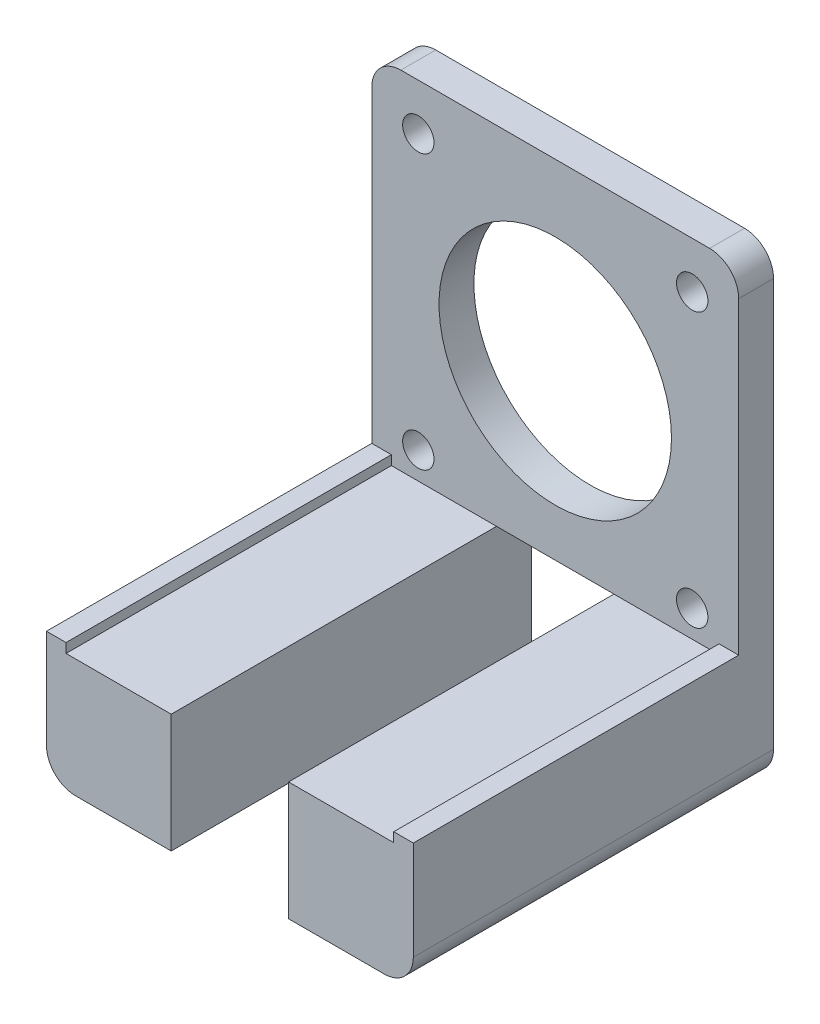
ISO-10303-21;
HEADER;
FILE_DESCRIPTION(('STEP AP214'),'2;1');
FILE_NAME('part.step','',(''),(''),'','','');
FILE_SCHEMA(('AUTOMOTIVE_DESIGN { 1 0 10303 214 1 1 1 1 }'));
ENDSEC;
DATA;
#1=APPLICATION_CONTEXT('core data for automotive mechanical design processes');
#2=APPLICATION_PROTOCOL_DEFINITION('international standard','automotive_design',2000,#1);
#3=PRODUCT_CONTEXT('',#1,'mechanical');
#4=PRODUCT('Part','Part','',(#3));
#5=PRODUCT_RELATED_PRODUCT_CATEGORY('part','',(#4));
#6=PRODUCT_DEFINITION_FORMATION('','',#4);
#7=PRODUCT_DEFINITION_CONTEXT('part definition',#1,'design');
#8=PRODUCT_DEFINITION('design','',#6,#7);
#9=PRODUCT_DEFINITION_SHAPE('','',#8);
#10=(LENGTH_UNIT() NAMED_UNIT(*) SI_UNIT(.MILLI.,.METRE.));
#11=(NAMED_UNIT(*) PLANE_ANGLE_UNIT() SI_UNIT($,.RADIAN.));
#12=(NAMED_UNIT(*) SI_UNIT($,.STERADIAN.) SOLID_ANGLE_UNIT());
#13=UNCERTAINTY_MEASURE_WITH_UNIT(LENGTH_MEASURE(1.E-05),#10,'distance_accuracy_value','');
#14=(GEOMETRIC_REPRESENTATION_CONTEXT(3) GLOBAL_UNCERTAINTY_ASSIGNED_CONTEXT((#13)) GLOBAL_UNIT_ASSIGNED_CONTEXT((#10,
#11,#12)) REPRESENTATION_CONTEXT('',''));
#15=CARTESIAN_POINT('',(0.,0.,0.));
#16=DIRECTION('',(0.,0.,1.));
#17=DIRECTION('',(1.,0.,0.));
#18=AXIS2_PLACEMENT_3D('',#15,#16,#17);
#19=CARTESIAN_POINT('',(0.,8.,6.));
#20=DIRECTION('',(0.,1.,0.));
#21=DIRECTION('',(0.,0.,1.));
#22=AXIS2_PLACEMENT_3D('',#19,#20,#21);
#23=PLANE('',#22);
#24=DIRECTION('',(1.,0.,0.));
#25=VECTOR('',#24,1.);
#26=CARTESIAN_POINT('',(0.,8.,0.));
#27=LINE('',#26,#25);
#28=CARTESIAN_POINT('',(-2.99999999999947,8.,0.));
#29=VERTEX_POINT('',#28);
#30=CARTESIAN_POINT('',(50.1400000000005,8.,0.));
#31=VERTEX_POINT('',#30);
#32=EDGE_CURVE('E395',#29,#31,#27,.T.);
#33=ORIENTED_EDGE('',*,*,#32,.F.);
#34=DIRECTION('',(0.,0.,-1.));
#35=VECTOR('',#34,1.);
#36=CARTESIAN_POINT('',(-2.99999999999947,8.,6.));
#37=LINE('',#36,#35);
#38=CARTESIAN_POINT('',(-2.99999999999947,8.,6.));
#39=VERTEX_POINT('',#38);
#40=EDGE_CURVE('E11',#39,#29,#37,.T.);
#41=ORIENTED_EDGE('',*,*,#40,.F.);
#42=DIRECTION('',(1.,0.,0.));
#43=VECTOR('',#42,1.);
#44=CARTESIAN_POINT('',(0.,8.,6.));
#45=LINE('',#44,#43);
#46=CARTESIAN_POINT('',(50.1400000000005,8.,6.));
#47=VERTEX_POINT('',#46);
#48=EDGE_CURVE('E357',#39,#47,#45,.T.);
#49=ORIENTED_EDGE('',*,*,#48,.T.);
#50=DIRECTION('',(0.,0.,-1.));
#51=VECTOR('',#50,1.);
#52=CARTESIAN_POINT('',(50.1400000000005,8.,6.));
#53=LINE('',#52,#51);
#54=EDGE_CURVE('E379',#47,#31,#53,.T.);
#55=ORIENTED_EDGE('',*,*,#54,.T.);
#56=EDGE_LOOP('',(#33,#41,#49,#55));
#57=FACE_BOUND('',#56,.T.);
#58=ADVANCED_FACE('F40',(#57),#23,.T.);
#59=CARTESIAN_POINT('',(-2.99999999999951,3.,6.));
#60=DIRECTION('',(0.,0.,-1.));
#61=DIRECTION('',(-1.,0.,0.));
#62=AXIS2_PLACEMENT_3D('',#59,#60,#61);
#63=CYLINDRICAL_SURFACE('',#62,5.);
#64=CARTESIAN_POINT('',(-2.99999999999951,3.,0.));
#65=DIRECTION('',(0.,0.,1.));
#66=DIRECTION('',(1.,0.,0.));
#67=AXIS2_PLACEMENT_3D('',#64,#65,#66);
#68=CIRCLE('',#67,5.);
#69=CARTESIAN_POINT('',(-7.99999999999951,2.99999999999996,0.));
#70=VERTEX_POINT('',#69);
#71=EDGE_CURVE('E399',#29,#70,#68,.T.);
#72=ORIENTED_EDGE('',*,*,#71,.T.);
#73=DIRECTION('',(0.,0.,-1.));
#74=VECTOR('',#73,1.);
#75=CARTESIAN_POINT('',(-7.99999999999951,2.99999999999996,6.));
#76=LINE('',#75,#74);
#77=CARTESIAN_POINT('',(-7.99999999999951,2.99999999999996,6.));
#78=VERTEX_POINT('',#77);
#79=EDGE_CURVE('E49',#78,#70,#76,.T.);
#80=ORIENTED_EDGE('',*,*,#79,.F.);
#81=CARTESIAN_POINT('',(-2.99999999999951,3.,6.));
#82=DIRECTION('',(0.,0.,1.));
#83=DIRECTION('',(1.,0.,0.));
#84=AXIS2_PLACEMENT_3D('',#81,#82,#83);
#85=CIRCLE('',#84,5.);
#86=EDGE_CURVE('E361',#39,#78,#85,.T.);
#87=ORIENTED_EDGE('',*,*,#86,.F.);
#88=ORIENTED_EDGE('',*,*,#40,.T.);
#89=EDGE_LOOP('',(#72,#80,#87,#88));
#90=FACE_BOUND('',#89,.T.);
#91=ADVANCED_FACE('F432',(#90),#63,.T.);
#92=CARTESIAN_POINT('',(-7.99999999999951,0.,6.));
#93=DIRECTION('',(-1.,0.,0.));
#94=DIRECTION('',(0.,0.,1.));
#95=AXIS2_PLACEMENT_3D('',#92,#93,#94);
#96=PLANE('',#95);
#97=DIRECTION('',(0.,1.,0.));
#98=VECTOR('',#97,1.);
#99=CARTESIAN_POINT('',(-7.99999999999951,0.,0.));
#100=LINE('',#99,#98);
#101=CARTESIAN_POINT('',(-7.99999999999951,-67.17,0.));
#102=VERTEX_POINT('',#101);
#103=EDGE_CURVE('E403',#102,#70,#100,.T.);
#104=ORIENTED_EDGE('',*,*,#103,.F.);
#105=DIRECTION('',(0.,0.,1.));
#106=VECTOR('',#105,1.);
#107=CARTESIAN_POINT('',(-7.99999999999951,-67.17,0.));
#108=LINE('',#107,#106);
#109=CARTESIAN_POINT('',(-7.99999999999951,-67.17,62.));
#110=VERTEX_POINT('',#109);
#111=EDGE_CURVE('E315',#102,#110,#108,.T.);
#112=ORIENTED_EDGE('',*,*,#111,.T.);
#113=DIRECTION('',(0.,-1.,0.));
#114=VECTOR('',#113,1.);
#115=CARTESIAN_POINT('',(-7.99999999999951,0.,62.));
#116=LINE('',#115,#114);
#117=CARTESIAN_POINT('',(-7.99999999999951,-50.14,62.));
#118=VERTEX_POINT('',#117);
#119=EDGE_CURVE('E291',#118,#110,#116,.T.);
#120=ORIENTED_EDGE('',*,*,#119,.F.);
#121=DIRECTION('',(0.,0.,1.));
#122=VECTOR('',#121,1.);
#123=CARTESIAN_POINT('',(-7.99999999999951,-50.14,0.));
#124=LINE('',#123,#122);
#125=CARTESIAN_POINT('',(-7.99999999999951,-50.14,6.));
#126=VERTEX_POINT('',#125);
#127=EDGE_CURVE('E318',#126,#118,#124,.T.);
#128=ORIENTED_EDGE('',*,*,#127,.F.);
#129=DIRECTION('',(0.,1.,0.));
#130=VECTOR('',#129,1.);
#131=CARTESIAN_POINT('',(-7.99999999999951,0.,6.));
#132=LINE('',#131,#130);
#133=EDGE_CURVE('E364',#126,#78,#132,.T.);
#134=ORIENTED_EDGE('',*,*,#133,.T.);
#135=ORIENTED_EDGE('',*,*,#79,.T.);
#136=EDGE_LOOP('',(#104,#112,#120,#128,#134,#135));
#137=FACE_BOUND('',#136,.T.);
#138=ADVANCED_FACE('F425',(#137),#96,.T.);
#139=CARTESIAN_POINT('',(55.1400000000005,0.,6.));
#140=DIRECTION('',(-1.,0.,0.));
#141=DIRECTION('',(0.,0.,1.));
#142=AXIS2_PLACEMENT_3D('',#139,#140,#141);
#143=PLANE('',#142);
#144=DIRECTION('',(0.,1.,0.));
#145=VECTOR('',#144,1.);
#146=CARTESIAN_POINT('',(55.1400000000005,0.,0.));
#147=LINE('',#146,#145);
#148=CARTESIAN_POINT('',(55.1400000000005,-67.17,0.));
#149=VERTEX_POINT('',#148);
#150=CARTESIAN_POINT('',(55.1400000000005,2.99999999999996,0.));
#151=VERTEX_POINT('',#150);
#152=EDGE_CURVE('E407',#149,#151,#147,.T.);
#153=ORIENTED_EDGE('',*,*,#152,.T.);
#154=DIRECTION('',(0.,0.,-1.));
#155=VECTOR('',#154,1.);
#156=CARTESIAN_POINT('',(55.1400000000005,2.99999999999996,6.));
#157=LINE('',#156,#155);
#158=CARTESIAN_POINT('',(55.1400000000005,2.99999999999996,6.));
#159=VERTEX_POINT('',#158);
#160=EDGE_CURVE('E420',#159,#151,#157,.T.);
#161=ORIENTED_EDGE('',*,*,#160,.F.);
#162=DIRECTION('',(0.,1.,0.));
#163=VECTOR('',#162,1.);
#164=CARTESIAN_POINT('',(55.1400000000005,0.,6.));
#165=LINE('',#164,#163);
#166=CARTESIAN_POINT('',(55.1400000000005,-50.14,6.));
#167=VERTEX_POINT('',#166);
#168=EDGE_CURVE('E368',#167,#159,#165,.T.);
#169=ORIENTED_EDGE('',*,*,#168,.F.);
#170=DIRECTION('',(0.,0.,-1.));
#171=VECTOR('',#170,1.);
#172=CARTESIAN_POINT('',(55.1400000000005,-50.14,62.));
#173=LINE('',#172,#171);
#174=CARTESIAN_POINT('',(55.1400000000005,-50.14,62.));
#175=VERTEX_POINT('',#174);
#176=EDGE_CURVE('E262',#175,#167,#173,.T.);
#177=ORIENTED_EDGE('',*,*,#176,.F.);
#178=DIRECTION('',(0.,-1.,0.));
#179=VECTOR('',#178,1.);
#180=CARTESIAN_POINT('',(55.1400000000005,0.,62.));
#181=LINE('',#180,#179);
#182=CARTESIAN_POINT('',(55.1400000000005,-67.17,62.));
#183=VERTEX_POINT('',#182);
#184=EDGE_CURVE('E214',#175,#183,#181,.T.);
#185=ORIENTED_EDGE('',*,*,#184,.T.);
#186=DIRECTION('',(0.,0.,-1.));
#187=VECTOR('',#186,1.);
#188=CARTESIAN_POINT('',(55.1400000000005,-67.17,62.));
#189=LINE('',#188,#187);
#190=EDGE_CURVE('E240',#183,#149,#189,.T.);
#191=ORIENTED_EDGE('',*,*,#190,.T.);
#192=EDGE_LOOP('',(#153,#161,#169,#177,#185,#191));
#193=FACE_BOUND('',#192,.T.);
#194=ADVANCED_FACE('F460',(#193),#143,.F.);
#195=CARTESIAN_POINT('',(50.1400000000005,3.,6.));
#196=DIRECTION('',(0.,0.,-1.));
#197=DIRECTION('',(-1.,0.,0.));
#198=AXIS2_PLACEMENT_3D('',#195,#196,#197);
#199=CYLINDRICAL_SURFACE('',#198,5.);
#200=CARTESIAN_POINT('',(50.1400000000005,3.,0.));
#201=DIRECTION('',(0.,0.,1.));
#202=DIRECTION('',(1.,0.,0.));
#203=AXIS2_PLACEMENT_3D('',#200,#201,#202);
#204=CIRCLE('',#203,5.);
#205=EDGE_CURVE('E411',#31,#151,#204,.F.);
#206=ORIENTED_EDGE('',*,*,#205,.F.);
#207=ORIENTED_EDGE('',*,*,#54,.F.);
#208=CARTESIAN_POINT('',(50.1400000000005,3.,6.));
#209=DIRECTION('',(0.,0.,1.));
#210=DIRECTION('',(1.,0.,0.));
#211=AXIS2_PLACEMENT_3D('',#208,#209,#210);
#212=CIRCLE('',#211,5.);
#213=EDGE_CURVE('E371',#47,#159,#212,.F.);
#214=ORIENTED_EDGE('',*,*,#213,.T.);
#215=ORIENTED_EDGE('',*,*,#160,.T.);
#216=EDGE_LOOP('',(#206,#207,#214,#215));
#217=FACE_BOUND('',#216,.T.);
#218=ADVANCED_FACE('F456',(#217),#199,.T.);
#219=CARTESIAN_POINT('',(47.1400000000005,-47.14,6.));
#220=DIRECTION('',(0.,0.,-1.));
#221=DIRECTION('',(-1.,0.,0.));
#222=AXIS2_PLACEMENT_3D('',#219,#220,#221);
#223=CYLINDRICAL_SURFACE('',#222,2.7);
#224=CARTESIAN_POINT('',(47.1400000000005,-47.14,6.));
#225=DIRECTION('',(0.,0.,1.));
#226=DIRECTION('',(1.,0.,0.));
#227=AXIS2_PLACEMENT_3D('',#224,#225,#226);
#228=CIRCLE('',#227,2.7);
#229=CARTESIAN_POINT('',(49.8400000000005,-47.14,6.));
#230=VERTEX_POINT('',#229);
#231=EDGE_CURVE('E353',#230,#230,#228,.T.);
#232=ORIENTED_EDGE('',*,*,#231,.T.);
#233=EDGE_LOOP('',(#232));
#234=FACE_BOUND('',#233,.T.);
#235=CARTESIAN_POINT('',(47.1400000000005,-47.14,0.));
#236=DIRECTION('',(0.,0.,1.));
#237=DIRECTION('',(1.,0.,0.));
#238=AXIS2_PLACEMENT_3D('',#235,#236,#237);
#239=CIRCLE('',#238,2.7);
#240=CARTESIAN_POINT('',(49.8400000000005,-47.14,0.));
#241=VERTEX_POINT('',#240);
#242=EDGE_CURVE('E391',#241,#241,#239,.T.);
#243=ORIENTED_EDGE('',*,*,#242,.F.);
#244=EDGE_LOOP('',(#243));
#245=FACE_BOUND('',#244,.T.);
#246=ADVANCED_FACE('F502',(#234,#245),#223,.F.);
#247=CARTESIAN_POINT('',(4.90878798433606E-13,-47.14,6.));
#248=DIRECTION('',(0.,0.,-1.));
#249=DIRECTION('',(-1.,0.,0.));
#250=AXIS2_PLACEMENT_3D('',#247,#248,#249);
#251=CYLINDRICAL_SURFACE('',#250,2.7);
#252=CARTESIAN_POINT('',(4.90878798433606E-13,-47.14,6.));
#253=DIRECTION('',(0.,0.,1.));
#254=DIRECTION('',(1.,0.,0.));
#255=AXIS2_PLACEMENT_3D('',#252,#253,#254);
#256=CIRCLE('',#255,2.7);
#257=CARTESIAN_POINT('',(2.70000000000049,-47.14,6.));
#258=VERTEX_POINT('',#257);
#259=EDGE_CURVE('E349',#258,#258,#256,.T.);
#260=ORIENTED_EDGE('',*,*,#259,.T.);
#261=EDGE_LOOP('',(#260));
#262=FACE_BOUND('',#261,.T.);
#263=CARTESIAN_POINT('',(4.90878798433606E-13,-47.14,0.));
#264=DIRECTION('',(0.,0.,1.));
#265=DIRECTION('',(1.,0.,0.));
#266=AXIS2_PLACEMENT_3D('',#263,#264,#265);
#267=CIRCLE('',#266,2.7);
#268=CARTESIAN_POINT('',(2.70000000000049,-47.14,0.));
#269=VERTEX_POINT('',#268);
#270=EDGE_CURVE('E387',#269,#269,#267,.T.);
#271=ORIENTED_EDGE('',*,*,#270,.F.);
#272=EDGE_LOOP('',(#271));
#273=FACE_BOUND('',#272,.T.);
#274=ADVANCED_FACE('F505',(#262,#273),#251,.F.);
#275=CARTESIAN_POINT('',(47.14,0.,6.));
#276=DIRECTION('',(0.,0.,-1.));
#277=DIRECTION('',(-1.,0.,0.));
#278=AXIS2_PLACEMENT_3D('',#275,#276,#277);
#279=CYLINDRICAL_SURFACE('',#278,2.7);
#280=CARTESIAN_POINT('',(47.14,0.,6.));
#281=DIRECTION('',(0.,0.,1.));
#282=DIRECTION('',(1.,0.,0.));
#283=AXIS2_PLACEMENT_3D('',#280,#281,#282);
#284=CIRCLE('',#283,2.7);
#285=CARTESIAN_POINT('',(49.84,0.,6.));
#286=VERTEX_POINT('',#285);
#287=EDGE_CURVE('E344',#286,#286,#284,.T.);
#288=ORIENTED_EDGE('',*,*,#287,.T.);
#289=EDGE_LOOP('',(#288));
#290=FACE_BOUND('',#289,.T.);
#291=CARTESIAN_POINT('',(47.14,0.,0.));
#292=DIRECTION('',(0.,0.,1.));
#293=DIRECTION('',(1.,0.,0.));
#294=AXIS2_PLACEMENT_3D('',#291,#292,#293);
#295=CIRCLE('',#294,2.7);
#296=CARTESIAN_POINT('',(49.84,0.,0.));
#297=VERTEX_POINT('',#296);
#298=EDGE_CURVE('E383',#297,#297,#295,.T.);
#299=ORIENTED_EDGE('',*,*,#298,.F.);
#300=EDGE_LOOP('',(#299));
#301=FACE_BOUND('',#300,.T.);
#302=ADVANCED_FACE('F508',(#290,#301),#279,.F.);
#303=CARTESIAN_POINT('',(0.,0.,6.));
#304=DIRECTION('',(0.,0.,-1.));
#305=DIRECTION('',(-1.,0.,0.));
#306=AXIS2_PLACEMENT_3D('',#303,#304,#305);
#307=CYLINDRICAL_SURFACE('',#306,2.7);
#308=CARTESIAN_POINT('',(0.,0.,6.));
#309=DIRECTION('',(0.,0.,1.));
#310=DIRECTION('',(1.,0.,0.));
#311=AXIS2_PLACEMENT_3D('',#308,#309,#310);
#312=CIRCLE('',#311,2.7);
#313=CARTESIAN_POINT('',(2.7,0.,6.));
#314=VERTEX_POINT('',#313);
#315=EDGE_CURVE('E340',#314,#314,#312,.T.);
#316=ORIENTED_EDGE('',*,*,#315,.T.);
#317=EDGE_LOOP('',(#316));
#318=FACE_BOUND('',#317,.T.);
#319=CARTESIAN_POINT('',(0.,0.,0.));
#320=DIRECTION('',(0.,0.,1.));
#321=DIRECTION('',(1.,0.,0.));
#322=AXIS2_PLACEMENT_3D('',#319,#320,#321);
#323=CIRCLE('',#322,2.7);
#324=CARTESIAN_POINT('',(2.7,0.,0.));
#325=VERTEX_POINT('',#324);
#326=EDGE_CURVE('E339',#325,#325,#323,.T.);
#327=ORIENTED_EDGE('',*,*,#326,.F.);
#328=EDGE_LOOP('',(#327));
#329=FACE_BOUND('',#328,.T.);
#330=ADVANCED_FACE('F42',(#318,#329),#307,.F.);
#331=CARTESIAN_POINT('',(23.5700000000002,-23.57,6.));
#332=DIRECTION('',(0.,0.,-1.));
#333=DIRECTION('',(-1.,0.,0.));
#334=AXIS2_PLACEMENT_3D('',#331,#332,#333);
#335=CYLINDRICAL_SURFACE('',#334,20.);
#336=CARTESIAN_POINT('',(23.5700000000002,-23.57,6.));
#337=DIRECTION('',(0.,0.,1.));
#338=DIRECTION('',(1.,0.,0.));
#339=AXIS2_PLACEMENT_3D('',#336,#337,#338);
#340=CIRCLE('',#339,20.);
#341=CARTESIAN_POINT('',(43.5700000000002,-23.57,6.));
#342=VERTEX_POINT('',#341);
#343=EDGE_CURVE('E375',#342,#342,#340,.T.);
#344=ORIENTED_EDGE('',*,*,#343,.T.);
#345=EDGE_LOOP('',(#344));
#346=FACE_BOUND('',#345,.T.);
#347=CARTESIAN_POINT('',(23.5700000000002,-23.57,0.));
#348=DIRECTION('',(0.,0.,1.));
#349=DIRECTION('',(1.,0.,0.));
#350=AXIS2_PLACEMENT_3D('',#347,#348,#349);
#351=CIRCLE('',#350,20.);
#352=CARTESIAN_POINT('',(43.5700000000002,-23.57,0.));
#353=VERTEX_POINT('',#352);
#354=EDGE_CURVE('E345',#353,#353,#351,.T.);
#355=ORIENTED_EDGE('',*,*,#354,.F.);
#356=EDGE_LOOP('',(#355));
#357=FACE_BOUND('',#356,.T.);
#358=ADVANCED_FACE('F515',(#346,#357),#335,.F.);
#359=CARTESIAN_POINT('',(0.,0.,6.));
#360=DIRECTION('',(0.,0.,1.));
#361=DIRECTION('',(1.,0.,0.));
#362=AXIS2_PLACEMENT_3D('',#359,#360,#361);
#363=PLANE('',#362);
#364=DIRECTION('',(-1.,0.,0.));
#365=VECTOR('',#364,1.);
#366=CARTESIAN_POINT('',(0.,-51.77,6.));
#367=LINE('',#366,#365);
#368=CARTESIAN_POINT('',(33.67,-51.77,6.));
#369=VERTEX_POINT('',#368);
#370=CARTESIAN_POINT('',(13.4700000000005,-51.77,6.));
#371=VERTEX_POINT('',#370);
#372=EDGE_CURVE('E191',#369,#371,#367,.T.);
#373=ORIENTED_EDGE('',*,*,#372,.F.);
#374=DIRECTION('',(-1.,0.,0.));
#375=VECTOR('',#374,1.);
#376=CARTESIAN_POINT('',(0.,-51.77,6.));
#377=LINE('',#376,#375);
#378=CARTESIAN_POINT('',(51.77,-51.77,6.));
#379=VERTEX_POINT('',#378);
#380=EDGE_CURVE('E266',#379,#369,#377,.T.);
#381=ORIENTED_EDGE('',*,*,#380,.F.);
#382=DIRECTION('',(0.,-1.,0.));
#383=VECTOR('',#382,1.);
#384=CARTESIAN_POINT('',(51.77,0.,6.));
#385=LINE('',#384,#383);
#386=CARTESIAN_POINT('',(51.77,-50.14,6.));
#387=VERTEX_POINT('',#386);
#388=EDGE_CURVE('E64',#387,#379,#385,.T.);
#389=ORIENTED_EDGE('',*,*,#388,.F.);
#390=DIRECTION('',(-1.,0.,0.));
#391=VECTOR('',#390,1.);
#392=CARTESIAN_POINT('',(0.,-50.14,6.));
#393=LINE('',#392,#391);
#394=EDGE_CURVE('E272',#167,#387,#393,.T.);
#395=ORIENTED_EDGE('',*,*,#394,.F.);
#396=ORIENTED_EDGE('',*,*,#168,.T.);
#397=ORIENTED_EDGE('',*,*,#213,.F.);
#398=ORIENTED_EDGE('',*,*,#48,.F.);
#399=ORIENTED_EDGE('',*,*,#86,.T.);
#400=ORIENTED_EDGE('',*,*,#133,.F.);
#401=DIRECTION('',(1.,0.,0.));
#402=VECTOR('',#401,1.);
#403=CARTESIAN_POINT('',(0.,-50.14,6.));
#404=LINE('',#403,#402);
#405=CARTESIAN_POINT('',(-4.63,-50.14,6.));
#406=VERTEX_POINT('',#405);
#407=EDGE_CURVE('E335',#126,#406,#404,.T.);
#408=ORIENTED_EDGE('',*,*,#407,.T.);
#409=DIRECTION('',(0.,1.,0.));
#410=VECTOR('',#409,1.);
#411=CARTESIAN_POINT('',(-4.63,0.,6.));
#412=LINE('',#411,#410);
#413=CARTESIAN_POINT('',(-4.63,-51.77,6.));
#414=VERTEX_POINT('',#413);
#415=EDGE_CURVE('E332',#414,#406,#412,.T.);
#416=ORIENTED_EDGE('',*,*,#415,.F.);
#417=DIRECTION('',(1.,0.,0.));
#418=VECTOR('',#417,1.);
#419=CARTESIAN_POINT('',(0.,-51.77,6.));
#420=LINE('',#419,#418);
#421=EDGE_CURVE('E311',#414,#371,#420,.T.);
#422=ORIENTED_EDGE('',*,*,#421,.T.);
#423=EDGE_LOOP('',(#373,#381,#389,#395,#396,#397,#398,#399,#400,#408,#416,#422));
#424=FACE_BOUND('',#423,.T.);
#425=ORIENTED_EDGE('',*,*,#315,.F.);
#426=EDGE_LOOP('',(#425));
#427=FACE_BOUND('',#426,.T.);
#428=ORIENTED_EDGE('',*,*,#287,.F.);
#429=EDGE_LOOP('',(#428));
#430=FACE_BOUND('',#429,.T.);
#431=ORIENTED_EDGE('',*,*,#259,.F.);
#432=EDGE_LOOP('',(#431));
#433=FACE_BOUND('',#432,.T.);
#434=ORIENTED_EDGE('',*,*,#231,.F.);
#435=EDGE_LOOP('',(#434));
#436=FACE_BOUND('',#435,.T.);
#437=ORIENTED_EDGE('',*,*,#343,.F.);
#438=EDGE_LOOP('',(#437));
#439=FACE_BOUND('',#438,.T.);
#440=ADVANCED_FACE('F448',(#424,#427,#430,#433,#436,#439),#363,.T.);
#441=CARTESIAN_POINT('',(0.,0.,0.));
#442=DIRECTION('',(0.,0.,1.));
#443=DIRECTION('',(1.,0.,0.));
#444=AXIS2_PLACEMENT_3D('',#441,#442,#443);
#445=PLANE('',#444);
#446=DIRECTION('',(-1.,0.,0.));
#447=VECTOR('',#446,1.);
#448=CARTESIAN_POINT('',(13.4700000000005,-51.77,0.));
#449=LINE('',#448,#447);
#450=CARTESIAN_POINT('',(33.67,-51.77,0.));
#451=VERTEX_POINT('',#450);
#452=CARTESIAN_POINT('',(13.4700000000005,-51.77,0.));
#453=VERTEX_POINT('',#452);
#454=EDGE_CURVE('E188',#451,#453,#449,.T.);
#455=ORIENTED_EDGE('',*,*,#454,.T.);
#456=DIRECTION('',(0.,1.,0.));
#457=VECTOR('',#456,1.);
#458=CARTESIAN_POINT('',(13.4700000000005,0.,0.));
#459=LINE('',#458,#457);
#460=CARTESIAN_POINT('',(13.4700000000005,-72.17,0.));
#461=VERTEX_POINT('',#460);
#462=EDGE_CURVE('E173',#461,#453,#459,.T.);
#463=ORIENTED_EDGE('',*,*,#462,.F.);
#464=DIRECTION('',(1.,0.,0.));
#465=VECTOR('',#464,1.);
#466=CARTESIAN_POINT('',(0.,-72.17,0.));
#467=LINE('',#466,#465);
#468=CARTESIAN_POINT('',(-2.99999999999951,-72.17,0.));
#469=VERTEX_POINT('',#468);
#470=EDGE_CURVE('E305',#469,#461,#467,.T.);
#471=ORIENTED_EDGE('',*,*,#470,.F.);
#472=CARTESIAN_POINT('',(-2.99999999999951,-67.17,0.));
#473=DIRECTION('',(0.,0.,1.));
#474=DIRECTION('',(1.,0.,0.));
#475=AXIS2_PLACEMENT_3D('',#472,#473,#474);
#476=CIRCLE('',#475,5.);
#477=EDGE_CURVE('E183',#102,#469,#476,.T.);
#478=ORIENTED_EDGE('',*,*,#477,.F.);
#479=ORIENTED_EDGE('',*,*,#103,.T.);
#480=ORIENTED_EDGE('',*,*,#71,.F.);
#481=ORIENTED_EDGE('',*,*,#32,.T.);
#482=ORIENTED_EDGE('',*,*,#205,.T.);
#483=ORIENTED_EDGE('',*,*,#152,.F.);
#484=CARTESIAN_POINT('',(50.1400000000005,-67.17,0.));
#485=DIRECTION('',(0.,0.,1.));
#486=DIRECTION('',(1.,0.,0.));
#487=AXIS2_PLACEMENT_3D('',#484,#485,#486);
#488=CIRCLE('',#487,5.);
#489=CARTESIAN_POINT('',(50.1400000000005,-72.17,0.));
#490=VERTEX_POINT('',#489);
#491=EDGE_CURVE('E210',#490,#149,#488,.T.);
#492=ORIENTED_EDGE('',*,*,#491,.F.);
#493=DIRECTION('',(1.,0.,0.));
#494=VECTOR('',#493,1.);
#495=CARTESIAN_POINT('',(0.,-72.17,0.));
#496=LINE('',#495,#494);
#497=CARTESIAN_POINT('',(33.67,-72.17,0.));
#498=VERTEX_POINT('',#497);
#499=EDGE_CURVE('E206',#498,#490,#496,.T.);
#500=ORIENTED_EDGE('',*,*,#499,.F.);
#501=DIRECTION('',(0.,1.,0.));
#502=VECTOR('',#501,1.);
#503=CARTESIAN_POINT('',(33.67,0.,0.));
#504=LINE('',#503,#502);
#505=EDGE_CURVE('E56',#498,#451,#504,.T.);
#506=ORIENTED_EDGE('',*,*,#505,.T.);
#507=EDGE_LOOP('',(#455,#463,#471,#478,#479,#480,#481,#482,#483,#492,#500,#506));
#508=FACE_BOUND('',#507,.T.);
#509=ORIENTED_EDGE('',*,*,#326,.T.);
#510=EDGE_LOOP('',(#509));
#511=FACE_BOUND('',#510,.T.);
#512=ORIENTED_EDGE('',*,*,#298,.T.);
#513=EDGE_LOOP('',(#512));
#514=FACE_BOUND('',#513,.T.);
#515=ORIENTED_EDGE('',*,*,#270,.T.);
#516=EDGE_LOOP('',(#515));
#517=FACE_BOUND('',#516,.T.);
#518=ORIENTED_EDGE('',*,*,#242,.T.);
#519=EDGE_LOOP('',(#518));
#520=FACE_BOUND('',#519,.T.);
#521=ORIENTED_EDGE('',*,*,#354,.T.);
#522=EDGE_LOOP('',(#521));
#523=FACE_BOUND('',#522,.T.);
#524=ADVANCED_FACE('F195',(#508,#511,#514,#517,#520,#523),#445,.F.);
#525=CARTESIAN_POINT('',(13.4700000000005,0.,0.));
#526=DIRECTION('',(1.,0.,0.));
#527=DIRECTION('',(0.,0.,-1.));
#528=AXIS2_PLACEMENT_3D('',#525,#526,#527);
#529=PLANE('',#528);
#530=ORIENTED_EDGE('',*,*,#462,.T.);
#531=DIRECTION('',(0.,0.,1.));
#532=VECTOR('',#531,1.);
#533=CARTESIAN_POINT('',(13.4700000000005,-51.77,0.));
#534=LINE('',#533,#532);
#535=EDGE_CURVE('E176',#453,#371,#534,.T.);
#536=ORIENTED_EDGE('',*,*,#535,.T.);
#537=DIRECTION('',(0.,0.,1.));
#538=VECTOR('',#537,1.);
#539=CARTESIAN_POINT('',(13.4700000000005,-51.77,0.));
#540=LINE('',#539,#538);
#541=CARTESIAN_POINT('',(13.4700000000005,-51.77,62.));
#542=VERTEX_POINT('',#541);
#543=EDGE_CURVE('E308',#371,#542,#540,.T.);
#544=ORIENTED_EDGE('',*,*,#543,.T.);
#545=DIRECTION('',(0.,1.,0.));
#546=VECTOR('',#545,1.);
#547=CARTESIAN_POINT('',(13.4700000000005,0.,62.));
#548=LINE('',#547,#546);
#549=CARTESIAN_POINT('',(13.4700000000005,-72.17,62.));
#550=VERTEX_POINT('',#549);
#551=EDGE_CURVE('E275',#550,#542,#548,.T.);
#552=ORIENTED_EDGE('',*,*,#551,.F.);
#553=DIRECTION('',(0.,0.,1.));
#554=VECTOR('',#553,1.);
#555=CARTESIAN_POINT('',(13.4700000000005,-72.17,0.));
#556=LINE('',#555,#554);
#557=EDGE_CURVE('E179',#461,#550,#556,.T.);
#558=ORIENTED_EDGE('',*,*,#557,.F.);
#559=EDGE_LOOP('',(#530,#536,#544,#552,#558));
#560=FACE_BOUND('',#559,.T.);
#561=ADVANCED_FACE('F175',(#560),#529,.T.);
#562=CARTESIAN_POINT('',(0.,-72.17,0.));
#563=DIRECTION('',(0.,-1.,0.));
#564=DIRECTION('',(0.,0.,-1.));
#565=AXIS2_PLACEMENT_3D('',#562,#563,#564);
#566=PLANE('',#565);
#567=DIRECTION('',(1.,0.,0.));
#568=VECTOR('',#567,1.);
#569=CARTESIAN_POINT('',(0.,-72.17,62.));
#570=LINE('',#569,#568);
#571=CARTESIAN_POINT('',(-2.99999999999951,-72.17,62.));
#572=VERTEX_POINT('',#571);
#573=EDGE_CURVE('E184',#572,#550,#570,.T.);
#574=ORIENTED_EDGE('',*,*,#573,.F.);
#575=DIRECTION('',(0.,0.,1.));
#576=VECTOR('',#575,1.);
#577=CARTESIAN_POINT('',(-2.99999999999951,-72.17,0.));
#578=LINE('',#577,#576);
#579=EDGE_CURVE('E312',#469,#572,#578,.T.);
#580=ORIENTED_EDGE('',*,*,#579,.F.);
#581=ORIENTED_EDGE('',*,*,#470,.T.);
#582=ORIENTED_EDGE('',*,*,#557,.T.);
#583=EDGE_LOOP('',(#574,#580,#581,#582));
#584=FACE_BOUND('',#583,.T.);
#585=ADVANCED_FACE('F642',(#584),#566,.T.);
#586=CARTESIAN_POINT('',(-2.99999999999951,-67.17,0.));
#587=DIRECTION('',(0.,0.,1.));
#588=DIRECTION('',(1.,0.,0.));
#589=AXIS2_PLACEMENT_3D('',#586,#587,#588);
#590=CYLINDRICAL_SURFACE('',#589,5.);
#591=CARTESIAN_POINT('',(-2.99999999999951,-67.17,62.));
#592=DIRECTION('',(0.,0.,1.));
#593=DIRECTION('',(1.,0.,0.));
#594=AXIS2_PLACEMENT_3D('',#591,#592,#593);
#595=CIRCLE('',#594,5.);
#596=EDGE_CURVE('E295',#110,#572,#595,.T.);
#597=ORIENTED_EDGE('',*,*,#596,.F.);
#598=ORIENTED_EDGE('',*,*,#111,.F.);
#599=ORIENTED_EDGE('',*,*,#477,.T.);
#600=ORIENTED_EDGE('',*,*,#579,.T.);
#601=EDGE_LOOP('',(#597,#598,#599,#600));
#602=FACE_BOUND('',#601,.T.);
#603=ADVANCED_FACE('F437',(#602),#590,.T.);
#604=CARTESIAN_POINT('',(0.,-50.14,0.));
#605=DIRECTION('',(0.,-1.,0.));
#606=DIRECTION('',(0.,0.,-1.));
#607=AXIS2_PLACEMENT_3D('',#604,#605,#606);
#608=PLANE('',#607);
#609=ORIENTED_EDGE('',*,*,#407,.F.);
#610=ORIENTED_EDGE('',*,*,#127,.T.);
#611=DIRECTION('',(1.,0.,0.));
#612=VECTOR('',#611,1.);
#613=CARTESIAN_POINT('',(0.,-50.14,62.));
#614=LINE('',#613,#612);
#615=CARTESIAN_POINT('',(-4.63,-50.14,62.));
#616=VERTEX_POINT('',#615);
#617=EDGE_CURVE('E287',#118,#616,#614,.T.);
#618=ORIENTED_EDGE('',*,*,#617,.T.);
#619=DIRECTION('',(0.,0.,1.));
#620=VECTOR('',#619,1.);
#621=CARTESIAN_POINT('',(-4.63,-50.14,0.));
#622=LINE('',#621,#620);
#623=EDGE_CURVE('E321',#406,#616,#622,.T.);
#624=ORIENTED_EDGE('',*,*,#623,.F.);
#625=EDGE_LOOP('',(#609,#610,#618,#624));
#626=FACE_BOUND('',#625,.T.);
#627=ADVANCED_FACE('F447',(#626),#608,.F.);
#628=CARTESIAN_POINT('',(-4.63,0.,0.));
#629=DIRECTION('',(1.,0.,0.));
#630=DIRECTION('',(0.,0.,-1.));
#631=AXIS2_PLACEMENT_3D('',#628,#629,#630);
#632=PLANE('',#631);
#633=DIRECTION('',(0.,0.,1.));
#634=VECTOR('',#633,1.);
#635=CARTESIAN_POINT('',(-4.63,-51.77,0.));
#636=LINE('',#635,#634);
#637=CARTESIAN_POINT('',(-4.63,-51.77,62.));
#638=VERTEX_POINT('',#637);
#639=EDGE_CURVE('E324',#414,#638,#636,.T.);
#640=ORIENTED_EDGE('',*,*,#639,.F.);
#641=ORIENTED_EDGE('',*,*,#415,.T.);
#642=ORIENTED_EDGE('',*,*,#623,.T.);
#643=DIRECTION('',(0.,1.,0.));
#644=VECTOR('',#643,1.);
#645=CARTESIAN_POINT('',(-4.63,0.,62.));
#646=LINE('',#645,#644);
#647=EDGE_CURVE('E283',#638,#616,#646,.T.);
#648=ORIENTED_EDGE('',*,*,#647,.F.);
#649=EDGE_LOOP('',(#640,#641,#642,#648));
#650=FACE_BOUND('',#649,.T.);
#651=ADVANCED_FACE('F667',(#650),#632,.T.);
#652=CARTESIAN_POINT('',(0.,-51.77,0.));
#653=DIRECTION('',(0.,-1.,0.));
#654=DIRECTION('',(0.,0.,-1.));
#655=AXIS2_PLACEMENT_3D('',#652,#653,#654);
#656=PLANE('',#655);
#657=ORIENTED_EDGE('',*,*,#421,.F.);
#658=ORIENTED_EDGE('',*,*,#639,.T.);
#659=DIRECTION('',(1.,0.,0.));
#660=VECTOR('',#659,1.);
#661=CARTESIAN_POINT('',(0.,-51.77,62.));
#662=LINE('',#661,#660);
#663=EDGE_CURVE('E279',#638,#542,#662,.T.);
#664=ORIENTED_EDGE('',*,*,#663,.T.);
#665=ORIENTED_EDGE('',*,*,#543,.F.);
#666=EDGE_LOOP('',(#657,#658,#664,#665));
#667=FACE_BOUND('',#666,.T.);
#668=ADVANCED_FACE('F675',(#667),#656,.F.);
#669=CARTESIAN_POINT('',(0.,0.,62.));
#670=DIRECTION('',(0.,0.,1.));
#671=DIRECTION('',(1.,0.,0.));
#672=AXIS2_PLACEMENT_3D('',#669,#670,#671);
#673=PLANE('',#672);
#674=ORIENTED_EDGE('',*,*,#551,.T.);
#675=ORIENTED_EDGE('',*,*,#663,.F.);
#676=ORIENTED_EDGE('',*,*,#647,.T.);
#677=ORIENTED_EDGE('',*,*,#617,.F.);
#678=ORIENTED_EDGE('',*,*,#119,.T.);
#679=ORIENTED_EDGE('',*,*,#596,.T.);
#680=ORIENTED_EDGE('',*,*,#573,.T.);
#681=EDGE_LOOP('',(#674,#675,#676,#677,#678,#679,#680));
#682=FACE_BOUND('',#681,.T.);
#683=ADVANCED_FACE('F441',(#682),#673,.T.);
#684=CARTESIAN_POINT('',(33.67,0.,62.));
#685=DIRECTION('',(-1.,0.,0.));
#686=DIRECTION('',(0.,0.,1.));
#687=AXIS2_PLACEMENT_3D('',#684,#685,#686);
#688=PLANE('',#687);
#689=DIRECTION('',(0.,0.,1.));
#690=VECTOR('',#689,1.);
#691=CARTESIAN_POINT('',(33.67,-51.77,0.));
#692=LINE('',#691,#690);
#693=EDGE_CURVE('E193',#451,#369,#692,.T.);
#694=ORIENTED_EDGE('',*,*,#693,.F.);
#695=ORIENTED_EDGE('',*,*,#505,.F.);
#696=DIRECTION('',(0.,0.,-1.));
#697=VECTOR('',#696,1.);
#698=CARTESIAN_POINT('',(33.67,-72.17,62.));
#699=LINE('',#698,#697);
#700=CARTESIAN_POINT('',(33.67,-72.17,62.));
#701=VERTEX_POINT('',#700);
#702=EDGE_CURVE('E247',#701,#498,#699,.T.);
#703=ORIENTED_EDGE('',*,*,#702,.F.);
#704=DIRECTION('',(0.,1.,0.));
#705=VECTOR('',#704,1.);
#706=CARTESIAN_POINT('',(33.67,0.,62.));
#707=LINE('',#706,#705);
#708=CARTESIAN_POINT('',(33.67,-51.77,62.));
#709=VERTEX_POINT('',#708);
#710=EDGE_CURVE('E230',#701,#709,#707,.T.);
#711=ORIENTED_EDGE('',*,*,#710,.T.);
#712=DIRECTION('',(0.,0.,-1.));
#713=VECTOR('',#712,1.);
#714=CARTESIAN_POINT('',(33.67,-51.77,62.));
#715=LINE('',#714,#713);
#716=EDGE_CURVE('E250',#709,#369,#715,.T.);
#717=ORIENTED_EDGE('',*,*,#716,.T.);
#718=EDGE_LOOP('',(#694,#695,#703,#711,#717));
#719=FACE_BOUND('',#718,.T.);
#720=ADVANCED_FACE('F472',(#719),#688,.T.);
#721=CARTESIAN_POINT('',(0.,-50.14,62.));
#722=DIRECTION('',(0.,1.,0.));
#723=DIRECTION('',(0.,0.,1.));
#724=AXIS2_PLACEMENT_3D('',#721,#722,#723);
#725=PLANE('',#724);
#726=ORIENTED_EDGE('',*,*,#176,.T.);
#727=ORIENTED_EDGE('',*,*,#394,.T.);
#728=DIRECTION('',(0.,0.,-1.));
#729=VECTOR('',#728,1.);
#730=CARTESIAN_POINT('',(51.77,-50.14,62.));
#731=LINE('',#730,#729);
#732=CARTESIAN_POINT('',(51.77,-50.14,62.));
#733=VERTEX_POINT('',#732);
#734=EDGE_CURVE('E258',#733,#387,#731,.T.);
#735=ORIENTED_EDGE('',*,*,#734,.F.);
#736=DIRECTION('',(1.,0.,0.));
#737=VECTOR('',#736,1.);
#738=CARTESIAN_POINT('',(0.,-50.14,62.));
#739=LINE('',#738,#737);
#740=EDGE_CURVE('E218',#733,#175,#739,.T.);
#741=ORIENTED_EDGE('',*,*,#740,.T.);
#742=EDGE_LOOP('',(#726,#727,#735,#741));
#743=FACE_BOUND('',#742,.T.);
#744=ADVANCED_FACE('F484',(#743),#725,.T.);
#745=CARTESIAN_POINT('',(51.77,0.,62.));
#746=DIRECTION('',(-1.,0.,0.));
#747=DIRECTION('',(0.,-1.,0.));
#748=AXIS2_PLACEMENT_3D('',#745,#746,#747);
#749=PLANE('',#748);
#750=ORIENTED_EDGE('',*,*,#734,.T.);
#751=ORIENTED_EDGE('',*,*,#388,.T.);
#752=DIRECTION('',(0.,0.,-1.));
#753=VECTOR('',#752,1.);
#754=CARTESIAN_POINT('',(51.77,-51.77,62.));
#755=LINE('',#754,#753);
#756=CARTESIAN_POINT('',(51.77,-51.77,62.));
#757=VERTEX_POINT('',#756);
#758=EDGE_CURVE('E254',#757,#379,#755,.T.);
#759=ORIENTED_EDGE('',*,*,#758,.F.);
#760=DIRECTION('',(0.,1.,0.));
#761=VECTOR('',#760,1.);
#762=CARTESIAN_POINT('',(51.77,0.,62.));
#763=LINE('',#762,#761);
#764=EDGE_CURVE('E222',#757,#733,#763,.T.);
#765=ORIENTED_EDGE('',*,*,#764,.T.);
#766=EDGE_LOOP('',(#750,#751,#759,#765));
#767=FACE_BOUND('',#766,.T.);
#768=ADVANCED_FACE('F478',(#767),#749,.T.);
#769=CARTESIAN_POINT('',(0.,-51.77,62.));
#770=DIRECTION('',(0.,1.,0.));
#771=DIRECTION('',(0.,0.,1.));
#772=AXIS2_PLACEMENT_3D('',#769,#770,#771);
#773=PLANE('',#772);
#774=ORIENTED_EDGE('',*,*,#758,.T.);
#775=ORIENTED_EDGE('',*,*,#380,.T.);
#776=ORIENTED_EDGE('',*,*,#716,.F.);
#777=DIRECTION('',(1.,0.,0.));
#778=VECTOR('',#777,1.);
#779=CARTESIAN_POINT('',(0.,-51.77,62.));
#780=LINE('',#779,#778);
#781=EDGE_CURVE('E226',#709,#757,#780,.T.);
#782=ORIENTED_EDGE('',*,*,#781,.T.);
#783=EDGE_LOOP('',(#774,#775,#776,#782));
#784=FACE_BOUND('',#783,.T.);
#785=ADVANCED_FACE('F474',(#784),#773,.T.);
#786=CARTESIAN_POINT('',(0.,-72.17,62.));
#787=DIRECTION('',(0.,1.,0.));
#788=DIRECTION('',(0.,0.,1.));
#789=AXIS2_PLACEMENT_3D('',#786,#787,#788);
#790=PLANE('',#789);
#791=ORIENTED_EDGE('',*,*,#702,.T.);
#792=ORIENTED_EDGE('',*,*,#499,.T.);
#793=DIRECTION('',(0.,0.,-1.));
#794=VECTOR('',#793,1.);
#795=CARTESIAN_POINT('',(50.1400000000005,-72.17,62.));
#796=LINE('',#795,#794);
#797=CARTESIAN_POINT('',(50.1400000000005,-72.17,62.));
#798=VERTEX_POINT('',#797);
#799=EDGE_CURVE('E244',#798,#490,#796,.T.);
#800=ORIENTED_EDGE('',*,*,#799,.F.);
#801=DIRECTION('',(1.,0.,0.));
#802=VECTOR('',#801,1.);
#803=CARTESIAN_POINT('',(0.,-72.17,62.));
#804=LINE('',#803,#802);
#805=EDGE_CURVE('E234',#701,#798,#804,.T.);
#806=ORIENTED_EDGE('',*,*,#805,.F.);
#807=EDGE_LOOP('',(#791,#792,#800,#806));
#808=FACE_BOUND('',#807,.T.);
#809=ADVANCED_FACE('F469',(#808),#790,.F.);
#810=CARTESIAN_POINT('',(50.1400000000005,-67.17,62.));
#811=DIRECTION('',(0.,0.,-1.));
#812=DIRECTION('',(-1.,0.,0.));
#813=AXIS2_PLACEMENT_3D('',#810,#811,#812);
#814=CYLINDRICAL_SURFACE('',#813,5.);
#815=ORIENTED_EDGE('',*,*,#799,.T.);
#816=ORIENTED_EDGE('',*,*,#491,.T.);
#817=ORIENTED_EDGE('',*,*,#190,.F.);
#818=CARTESIAN_POINT('',(50.1400000000005,-67.17,62.));
#819=DIRECTION('',(0.,0.,1.));
#820=DIRECTION('',(1.,0.,0.));
#821=AXIS2_PLACEMENT_3D('',#818,#819,#820);
#822=CIRCLE('',#821,5.);
#823=EDGE_CURVE('E237',#798,#183,#822,.T.);
#824=ORIENTED_EDGE('',*,*,#823,.F.);
#825=EDGE_LOOP('',(#815,#816,#817,#824));
#826=FACE_BOUND('',#825,.T.);
#827=ADVANCED_FACE('F464',(#826),#814,.T.);
#828=CARTESIAN_POINT('',(0.,0.,62.));
#829=DIRECTION('',(0.,0.,1.));
#830=DIRECTION('',(1.,0.,0.));
#831=AXIS2_PLACEMENT_3D('',#828,#829,#830);
#832=PLANE('',#831);
#833=ORIENTED_EDGE('',*,*,#184,.F.);
#834=ORIENTED_EDGE('',*,*,#740,.F.);
#835=ORIENTED_EDGE('',*,*,#764,.F.);
#836=ORIENTED_EDGE('',*,*,#781,.F.);
#837=ORIENTED_EDGE('',*,*,#710,.F.);
#838=ORIENTED_EDGE('',*,*,#805,.T.);
#839=ORIENTED_EDGE('',*,*,#823,.T.);
#840=EDGE_LOOP('',(#833,#834,#835,#836,#837,#838,#839));
#841=FACE_BOUND('',#840,.T.);
#842=ADVANCED_FACE('F482',(#841),#832,.T.);
#843=CARTESIAN_POINT('',(13.4700000000005,-51.77,0.));
#844=DIRECTION('',(0.,1.,0.));
#845=DIRECTION('',(0.,0.,1.));
#846=AXIS2_PLACEMENT_3D('',#843,#844,#845);
#847=PLANE('',#846);
#848=ORIENTED_EDGE('',*,*,#372,.T.);
#849=ORIENTED_EDGE('',*,*,#535,.F.);
#850=ORIENTED_EDGE('',*,*,#454,.F.);
#851=ORIENTED_EDGE('',*,*,#693,.T.);
#852=EDGE_LOOP('',(#848,#849,#850,#851));
#853=FACE_BOUND('',#852,.T.);
#854=ADVANCED_FACE('F187',(#853),#847,.F.);
#855=CLOSED_SHELL('',(#58,#91,#138,#194,#218,#246,#274,#302,#330,#358,#440,#524,#561,#585,#603,
#627,#651,#668,#683,#720,#744,#768,#785,#809,#827,#842,#854));
#856=MANIFOLD_SOLID_BREP('B2',#855);
#857=ADVANCED_BREP_SHAPE_REPRESENTATION('',(#18,#856),#14);
#858=SHAPE_DEFINITION_REPRESENTATION(#9,#857);
ENDSEC;
END-ISO-10303-21;
